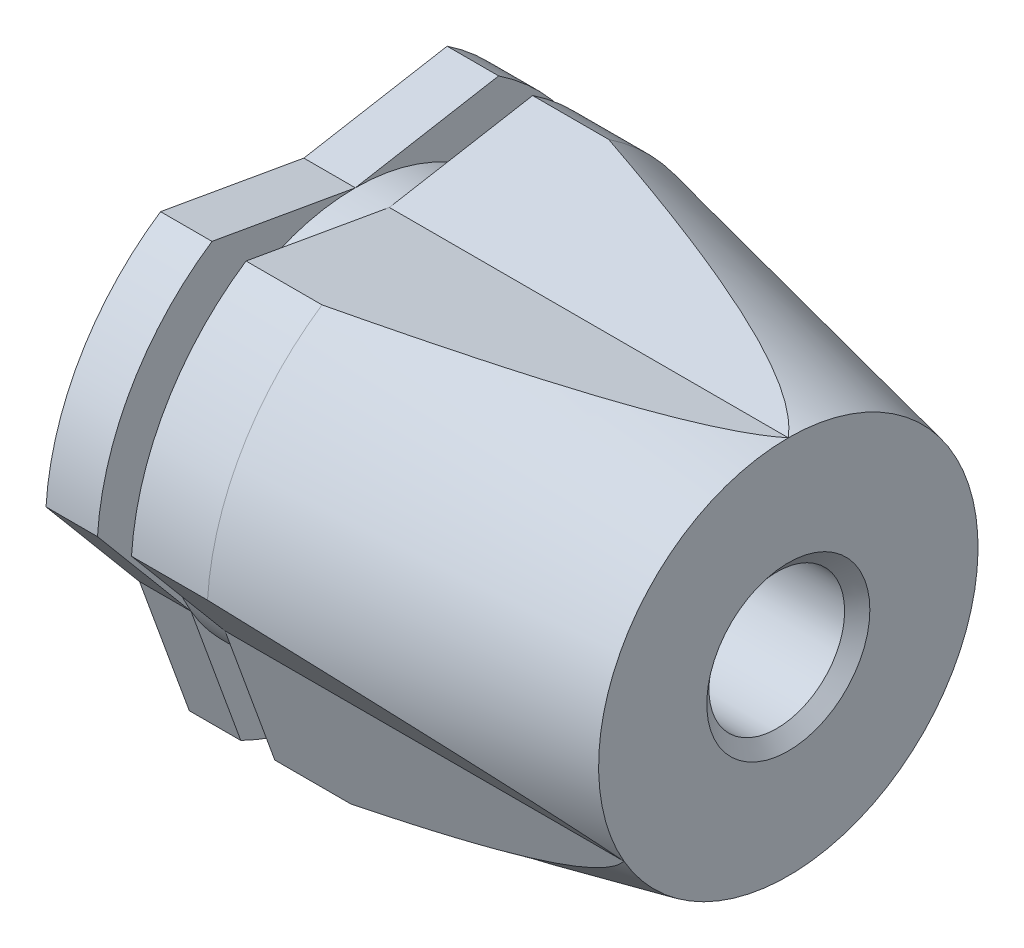
ISO-10303-21;
HEADER;
FILE_DESCRIPTION(('STEP AP214'),'2;1');
FILE_NAME('part.step','',(''),(''),'','','');
FILE_SCHEMA(('AUTOMOTIVE_DESIGN { 1 0 10303 214 1 1 1 1 }'));
ENDSEC;
DATA;
#1=APPLICATION_CONTEXT('core data for automotive mechanical design processes');
#2=APPLICATION_PROTOCOL_DEFINITION('international standard','automotive_design',2000,#1);
#3=PRODUCT_CONTEXT('',#1,'mechanical');
#4=PRODUCT('Part','Part','',(#3));
#5=PRODUCT_RELATED_PRODUCT_CATEGORY('part','',(#4));
#6=PRODUCT_DEFINITION_FORMATION('','',#4);
#7=PRODUCT_DEFINITION_CONTEXT('part definition',#1,'design');
#8=PRODUCT_DEFINITION('design','',#6,#7);
#9=PRODUCT_DEFINITION_SHAPE('','',#8);
#10=(LENGTH_UNIT() NAMED_UNIT(*) SI_UNIT(.MILLI.,.METRE.));
#11=(NAMED_UNIT(*) PLANE_ANGLE_UNIT() SI_UNIT($,.RADIAN.));
#12=(NAMED_UNIT(*) SI_UNIT($,.STERADIAN.) SOLID_ANGLE_UNIT());
#13=UNCERTAINTY_MEASURE_WITH_UNIT(LENGTH_MEASURE(1.E-05),#10,'distance_accuracy_value','');
#14=(GEOMETRIC_REPRESENTATION_CONTEXT(3) GLOBAL_UNCERTAINTY_ASSIGNED_CONTEXT((#13)) GLOBAL_UNIT_ASSIGNED_CONTEXT((#10,
#11,#12)) REPRESENTATION_CONTEXT('',''));
#15=CARTESIAN_POINT('',(0.,0.,0.));
#16=DIRECTION('',(0.,0.,1.));
#17=DIRECTION('',(1.,0.,0.));
#18=AXIS2_PLACEMENT_3D('',#15,#16,#17);
#19=CARTESIAN_POINT('',(5.,0.,0.));
#20=DIRECTION('',(-1.,0.,0.));
#21=DIRECTION('',(0.,0.,1.));
#22=AXIS2_PLACEMENT_3D('',#19,#20,#21);
#23=CYLINDRICAL_SURFACE('',#22,8.);
#24=CARTESIAN_POINT('',(1.59377475880434,0.,0.));
#25=DIRECTION('',(1.,0.,0.));
#26=DIRECTION('',(0.,0.,-1.));
#27=AXIS2_PLACEMENT_3D('',#24,#25,#26);
#28=CIRCLE('',#27,8.);
#29=CARTESIAN_POINT('',(1.59377475880434,-7.17096029452038,3.54645293982764));
#30=VERTEX_POINT('',#29);
#31=CARTESIAN_POINT('',(1.59377475880434,-7.17096029452012,-3.54645293982817));
#32=VERTEX_POINT('',#31);
#33=EDGE_CURVE('E485',#30,#32,#28,.T.);
#34=ORIENTED_EDGE('',*,*,#33,.F.);
#35=DIRECTION('',(-1.,0.,0.));
#36=VECTOR('',#35,1.);
#37=CARTESIAN_POINT('',(5.,-7.17096029452038,3.54645293982764));
#38=LINE('',#37,#36);
#39=CARTESIAN_POINT('',(0.,-7.17096029452039,3.54645293982764));
#40=VERTEX_POINT('',#39);
#41=EDGE_CURVE('E348',#40,#30,#38,.F.);
#42=ORIENTED_EDGE('',*,*,#41,.F.);
#43=CARTESIAN_POINT('',(0.,0.,0.));
#44=DIRECTION('',(1.,0.,0.));
#45=DIRECTION('',(0.,0.,-1.));
#46=AXIS2_PLACEMENT_3D('',#43,#44,#45);
#47=CIRCLE('',#46,8.);
#48=CARTESIAN_POINT('',(0.,-7.17096029452034,-3.54645293982774));
#49=VERTEX_POINT('',#48);
#50=EDGE_CURVE('E266',#40,#49,#47,.T.);
#51=ORIENTED_EDGE('',*,*,#50,.T.);
#52=DIRECTION('',(-1.,0.,0.));
#53=VECTOR('',#52,1.);
#54=CARTESIAN_POINT('',(5.,-7.17096029452034,-3.54645293982774));
#55=LINE('',#54,#53);
#56=EDGE_CURVE('E431',#49,#32,#55,.F.);
#57=ORIENTED_EDGE('',*,*,#56,.T.);
#58=EDGE_LOOP('',(#34,#42,#51,#57));
#59=FACE_BOUND('',#58,.T.);
#60=ADVANCED_FACE('F53',(#59),#23,.T.);
#61=CARTESIAN_POINT('',(2.64728139691783,0.,0.));
#62=DIRECTION('',(-1.,0.,0.));
#63=DIRECTION('',(0.,0.,1.));
#64=AXIS2_PLACEMENT_3D('',#61,#62,#63);
#65=CIRCLE('',#64,8.);
#66=CARTESIAN_POINT('',(2.64728139691783,-7.17096029452012,-3.54645293982817));
#67=VERTEX_POINT('',#66);
#68=CARTESIAN_POINT('',(2.64728139691783,-7.17096029452038,3.54645293982764));
#69=VERTEX_POINT('',#68);
#70=EDGE_CURVE('E76',#67,#69,#65,.T.);
#71=ORIENTED_EDGE('',*,*,#70,.F.);
#72=CARTESIAN_POINT('',(5.0000000000043,-7.17096029451909,-3.54645293982819));
#73=VERTEX_POINT('',#72);
#74=EDGE_CURVE('E430',#67,#73,#55,.F.);
#75=ORIENTED_EDGE('',*,*,#74,.T.);
#76=CARTESIAN_POINT('',(5.,0.,0.));
#77=DIRECTION('',(1.,0.,0.));
#78=DIRECTION('',(0.,0.,-1.));
#79=AXIS2_PLACEMENT_3D('',#76,#77,#78);
#80=CIRCLE('',#79,8.);
#81=CARTESIAN_POINT('',(5.,-7.17096029451996,3.5464529398285));
#82=VERTEX_POINT('',#81);
#83=EDGE_CURVE('E260',#82,#73,#80,.T.);
#84=ORIENTED_EDGE('',*,*,#83,.F.);
#85=EDGE_CURVE('E442',#69,#82,#38,.F.);
#86=ORIENTED_EDGE('',*,*,#85,.F.);
#87=EDGE_LOOP('',(#71,#75,#84,#86));
#88=FACE_BOUND('',#87,.T.);
#89=ADVANCED_FACE('F311',(#88),#23,.T.);
#90=CARTESIAN_POINT('',(1.59377475880434,0.,0.));
#91=DIRECTION('',(1.,0.,0.));
#92=DIRECTION('',(0.,0.,-1.));
#93=AXIS2_PLACEMENT_3D('',#90,#91,#92);
#94=CIRCLE('',#93,8.);
#95=CARTESIAN_POINT('',(1.59377475880434,0.51416180804301,-7.98346025449804));
#96=VERTEX_POINT('',#95);
#97=CARTESIAN_POINT('',(1.59377475880434,6.65679848647695,-4.43700731467034));
#98=VERTEX_POINT('',#97);
#99=EDGE_CURVE('E496',#96,#98,#94,.T.);
#100=ORIENTED_EDGE('',*,*,#99,.F.);
#101=DIRECTION('',(-1.,0.,0.));
#102=VECTOR('',#101,1.);
#103=CARTESIAN_POINT('',(5.,0.514161808043487,-7.98346025449801));
#104=LINE('',#103,#102);
#105=CARTESIAN_POINT('',(0.,0.514161808043488,-7.98346025449801));
#106=VERTEX_POINT('',#105);
#107=EDGE_CURVE('E406',#106,#96,#104,.F.);
#108=ORIENTED_EDGE('',*,*,#107,.F.);
#109=CARTESIAN_POINT('',(0.,6.65679848647695,-4.43700731467034));
#110=VERTEX_POINT('',#109);
#111=EDGE_CURVE('E254',#106,#110,#47,.T.);
#112=ORIENTED_EDGE('',*,*,#111,.T.);
#113=DIRECTION('',(-1.,0.,0.));
#114=VECTOR('',#113,1.);
#115=CARTESIAN_POINT('',(5.,6.65679848647695,-4.43700731467034));
#116=LINE('',#115,#114);
#117=EDGE_CURVE('E245',#110,#98,#116,.F.);
#118=ORIENTED_EDGE('',*,*,#117,.T.);
#119=EDGE_LOOP('',(#100,#108,#112,#118));
#120=FACE_BOUND('',#119,.T.);
#121=ADVANCED_FACE('F318',(#120),#23,.T.);
#122=CARTESIAN_POINT('',(2.64728139691783,0.,0.));
#123=DIRECTION('',(-1.,0.,0.));
#124=DIRECTION('',(0.,0.,1.));
#125=AXIS2_PLACEMENT_3D('',#122,#123,#124);
#126=CIRCLE('',#125,8.);
#127=CARTESIAN_POINT('',(2.64728139691783,6.65679848647695,-4.43700731467034));
#128=VERTEX_POINT('',#127);
#129=CARTESIAN_POINT('',(2.64728139691783,0.51416180804301,-7.98346025449804));
#130=VERTEX_POINT('',#129);
#131=EDGE_CURVE('E221',#128,#130,#126,.T.);
#132=ORIENTED_EDGE('',*,*,#131,.F.);
#133=CARTESIAN_POINT('',(5.0000000000043,6.65679848647673,-4.43700731466904));
#134=VERTEX_POINT('',#133);
#135=EDGE_CURVE('E219',#128,#134,#116,.F.);
#136=ORIENTED_EDGE('',*,*,#135,.T.);
#137=CARTESIAN_POINT('',(5.,0.514161808042532,-7.98346025449807));
#138=VERTEX_POINT('',#137);
#139=EDGE_CURVE('E261',#138,#134,#80,.T.);
#140=ORIENTED_EDGE('',*,*,#139,.F.);
#141=EDGE_CURVE('E405',#130,#138,#104,.F.);
#142=ORIENTED_EDGE('',*,*,#141,.F.);
#143=EDGE_LOOP('',(#132,#136,#140,#142));
#144=FACE_BOUND('',#143,.T.);
#145=ADVANCED_FACE('F329',(#144),#23,.T.);
#146=CARTESIAN_POINT('',(1.59377475880434,0.,0.));
#147=DIRECTION('',(1.,0.,0.));
#148=DIRECTION('',(0.,0.,-1.));
#149=AXIS2_PLACEMENT_3D('',#146,#147,#148);
#150=CIRCLE('',#149,8.);
#151=CARTESIAN_POINT('',(1.59377475880434,6.65679848647722,4.43700731466994));
#152=VERTEX_POINT('',#151);
#153=CARTESIAN_POINT('',(1.59377475880434,0.514161808042869,7.98346025449759));
#154=VERTEX_POINT('',#153);
#155=EDGE_CURVE('E364',#152,#154,#150,.T.);
#156=ORIENTED_EDGE('',*,*,#155,.F.);
#157=DIRECTION('',(-1.,0.,0.));
#158=VECTOR('',#157,1.);
#159=CARTESIAN_POINT('',(5.,6.65679848647695,4.43700731467034));
#160=LINE('',#159,#158);
#161=CARTESIAN_POINT('',(0.,6.65679848647695,4.43700731467035));
#162=VERTEX_POINT('',#161);
#163=EDGE_CURVE('E241',#162,#152,#160,.F.);
#164=ORIENTED_EDGE('',*,*,#163,.F.);
#165=CARTESIAN_POINT('',(0.,0.514161808043377,7.98346025449802));
#166=VERTEX_POINT('',#165);
#167=EDGE_CURVE('E262',#162,#166,#47,.T.);
#168=ORIENTED_EDGE('',*,*,#167,.T.);
#169=DIRECTION('',(-1.,0.,0.));
#170=VECTOR('',#169,1.);
#171=CARTESIAN_POINT('',(5.,0.514161808043374,7.98346025449802));
#172=LINE('',#171,#170);
#173=EDGE_CURVE('E343',#166,#154,#172,.F.);
#174=ORIENTED_EDGE('',*,*,#173,.T.);
#175=EDGE_LOOP('',(#156,#164,#168,#174));
#176=FACE_BOUND('',#175,.T.);
#177=ADVANCED_FACE('F322',(#176),#23,.T.);
#178=CARTESIAN_POINT('',(2.64728139691783,0.,0.));
#179=DIRECTION('',(-1.,0.,0.));
#180=DIRECTION('',(0.,0.,1.));
#181=AXIS2_PLACEMENT_3D('',#178,#179,#180);
#182=CIRCLE('',#181,8.);
#183=CARTESIAN_POINT('',(2.64728139691783,0.514161808042869,7.98346025449759));
#184=VERTEX_POINT('',#183);
#185=CARTESIAN_POINT('',(2.64728139691783,6.65679848647722,4.43700731466994));
#186=VERTEX_POINT('',#185);
#187=EDGE_CURVE('E184',#184,#186,#182,.T.);
#188=ORIENTED_EDGE('',*,*,#187,.F.);
#189=CARTESIAN_POINT('',(5.0000000000043,0.51416180804236,7.98346025449717));
#190=VERTEX_POINT('',#189);
#191=EDGE_CURVE('E333',#184,#190,#172,.F.);
#192=ORIENTED_EDGE('',*,*,#191,.T.);
#193=CARTESIAN_POINT('',(5.,6.65679848647749,4.43700731466955));
#194=VERTEX_POINT('',#193);
#195=EDGE_CURVE('E256',#194,#190,#80,.T.);
#196=ORIENTED_EDGE('',*,*,#195,.F.);
#197=EDGE_CURVE('E235',#186,#194,#160,.F.);
#198=ORIENTED_EDGE('',*,*,#197,.F.);
#199=EDGE_LOOP('',(#188,#192,#196,#198));
#200=FACE_BOUND('',#199,.T.);
#201=ADVANCED_FACE('F313',(#200),#23,.T.);
#202=CARTESIAN_POINT('',(0.,5.6972985122888,1.0045874448667));
#203=DIRECTION('',(0.,-0.984807753012208,-0.173648177666927));
#204=DIRECTION('',(0.,0.173648177666927,-0.984807753012209));
#205=AXIS2_PLACEMENT_3D('',#202,#203,#204);
#206=PLANE('',#205);
#207=DIRECTION('',(0.,-0.173648177666927,0.984807753012209));
#208=VECTOR('',#207,1.);
#209=CARTESIAN_POINT('',(1.59377475880434,5.6972985122888,1.0045874448667));
#210=LINE('',#209,#208);
#211=CARTESIAN_POINT('',(1.59377475880434,5.87443438329977,0.));
#212=VERTEX_POINT('',#211);
#213=EDGE_CURVE('E489',#98,#212,#210,.T.);
#214=ORIENTED_EDGE('',*,*,#213,.F.);
#215=ORIENTED_EDGE('',*,*,#117,.F.);
#216=DIRECTION('',(0.,0.173648177666927,-0.984807753012209));
#217=VECTOR('',#216,1.);
#218=CARTESIAN_POINT('',(0.,5.6972985122888,1.0045874448667));
#219=LINE('',#218,#217);
#220=CARTESIAN_POINT('',(0.,5.87443438329977,0.));
#221=VERTEX_POINT('',#220);
#222=EDGE_CURVE('E230',#221,#110,#219,.T.);
#223=ORIENTED_EDGE('',*,*,#222,.F.);
#224=DIRECTION('',(1.,0.,0.));
#225=VECTOR('',#224,1.);
#226=CARTESIAN_POINT('',(0.,5.87443438329977,0.));
#227=LINE('',#226,#225);
#228=EDGE_CURVE('E229',#221,#212,#227,.T.);
#229=ORIENTED_EDGE('',*,*,#228,.T.);
#230=EDGE_LOOP('',(#214,#215,#223,#229));
#231=FACE_BOUND('',#230,.T.);
#232=ADVANCED_FACE('F288',(#231),#206,.F.);
#233=DIRECTION('',(0.,0.173648177666927,-0.984807753012209));
#234=VECTOR('',#233,1.);
#235=CARTESIAN_POINT('',(2.64728139691783,5.6972985122888,1.0045874448667));
#236=LINE('',#235,#234);
#237=CARTESIAN_POINT('',(2.64728139691783,5.87443438329977,0.));
#238=VERTEX_POINT('',#237);
#239=EDGE_CURVE('E189',#238,#128,#236,.T.);
#240=ORIENTED_EDGE('',*,*,#239,.F.);
#241=CARTESIAN_POINT('',(15.,5.87443438329977,0.));
#242=VERTEX_POINT('',#241);
#243=EDGE_CURVE('E217',#238,#242,#227,.T.);
#244=ORIENTED_EDGE('',*,*,#243,.T.);
#245=CARTESIAN_POINT('',(4.9993,6.65683589353977,-4.43721946066561));
#246=CARTESIAN_POINT('',(5.31861236245896,6.63976852290642,-4.34042559188401));
#247=CARTESIAN_POINT('',(5.63755600687272,6.62249037544687,-4.24243634831996));
#248=CARTESIAN_POINT('',(6.27453945604708,6.58742248098328,-4.04355643599634));
#249=CARTESIAN_POINT('',(6.59257917812117,6.56963268873282,-3.94266551063157));
#250=CARTESIAN_POINT('',(7.22803683039662,6.53342567182418,-3.73732531389498));
#251=CARTESIAN_POINT('',(7.54545296593898,6.51500749383312,-3.63287063590381));
#252=CARTESIAN_POINT('',(8.17884855781919,6.47744732414788,-3.41985632842616));
#253=CARTESIAN_POINT('',(8.49482806500824,6.45830535830003,-3.3112968455215));
#254=CARTESIAN_POINT('',(9.2329154230582,6.41243225101641,-3.05113752617448));
#255=CARTESIAN_POINT('',(9.6543035197892,6.38534740636568,-2.89753173911964));
#256=CARTESIAN_POINT('',(10.2826210350122,6.34310285732095,-2.65795099614432));
#257=CARTESIAN_POINT('',(10.4913650257737,6.3287567564019,-2.57659021481973));
#258=CARTESIAN_POINT('',(10.9073278352411,6.29941370600297,-2.4101775065601));
#259=CARTESIAN_POINT('',(11.1145467017268,6.28441677701495,-2.3251256958403));
#260=CARTESIAN_POINT('',(11.6003234068065,6.24816836804422,-2.11955075305449));
#261=CARTESIAN_POINT('',(11.8780714236627,6.22658769317196,-1.99716066399637));
#262=CARTESIAN_POINT('',(12.4287357152088,6.18146489952355,-1.74125658472776));
#263=CARTESIAN_POINT('',(12.7016458927185,6.15792049316337,-1.60772962098359));
#264=CARTESIAN_POINT('',(13.0933911821179,6.12157505269203,-1.40160438521246));
#265=CARTESIAN_POINT('',(13.2155819018149,6.10986572196956,-1.33519747076625));
#266=CARTESIAN_POINT('',(13.4576270565982,6.08574291710586,-1.19839024610457));
#267=CARTESIAN_POINT('',(13.5774818359836,6.07332954780519,-1.12799053046944));
#268=CARTESIAN_POINT('',(13.8138353249092,6.0476707683746,-0.982472361171154));
#269=CARTESIAN_POINT('',(13.9303411609516,6.03442735079571,-0.9073652078264));
#270=CARTESIAN_POINT('',(14.1590656274899,6.00687480456898,-0.751106953326557));
#271=CARTESIAN_POINT('',(14.2712862343952,5.99256617641724,-0.669958690625931));
#272=CARTESIAN_POINT('',(14.4809018399964,5.96377669885971,-0.506685449957631));
#273=CARTESIAN_POINT('',(14.5787661196691,5.94940005016894,-0.425151423610638));
#274=CARTESIAN_POINT('',(14.7671677698552,5.91911393603385,-0.253390335129436));
#275=CARTESIAN_POINT('',(14.8576749882363,5.90319869570585,-0.163130522002412));
#276=CARTESIAN_POINT('',(15.0281237282215,5.86918892027109,0.0297484991100684));
#277=CARTESIAN_POINT('',(15.1078447571875,5.85106019998525,0.132561580880077));
#278=CARTESIAN_POINT('',(15.2459028909824,5.81261433627432,0.350598908783369));
#279=CARTESIAN_POINT('',(15.3044634147981,5.79232317500752,0.46567580277472));
#280=CARTESIAN_POINT('',(15.369982943394,5.75926122151717,0.65317945852561));
#281=CARTESIAN_POINT('',(15.3883071687971,5.74717938532225,0.721698956485443));
#282=CARTESIAN_POINT('',(15.4134599558605,5.72247621666328,0.861797587788001));
#283=CARTESIAN_POINT('',(15.4201086152957,5.70984946196539,0.933407472146943));
#284=CARTESIAN_POINT('',(15.4198685455638,5.6971750834023,1.00528744486669));
#285=B_SPLINE_CURVE_WITH_KNOTS('',3,(#245,#246,#247,#248,#249,#250,#251,#252,#253,#254,#255,
#256,#257,#258,#259,#260,#261,#262,#263,#264,#265,#266,#267,#268,#269,#270,#271,#272,#273,#274,
#275,#276,#277,#278,#279,#280,#281,#282,#283,#284),.UNSPECIFIED.,.F.,.F.,(4,2,2,2,2,2,2,2,2,2,2,
2,2,2,2,2,2,2,2,4),(0.,1.00229497140458,2.00467885323664,3.00865773656117,4.01260080178053,
5.36041566769028,6.03388215905735,6.70732746111592,7.62002698129565,8.53380498180935,
8.952432055995,9.37099695397846,9.78859294458712,10.2059939485494,10.5901987801624,
10.9759062210309,11.3685838870002,11.7569852464762,11.9719101110546,12.1901184958015),.UNSPECIFIED.);
#286=EDGE_CURVE('E275',#134,#242,#285,.T.);
#287=ORIENTED_EDGE('',*,*,#286,.F.);
#288=ORIENTED_EDGE('',*,*,#135,.F.);
#289=EDGE_LOOP('',(#240,#244,#287,#288));
#290=FACE_BOUND('',#289,.T.);
#291=ADVANCED_FACE('F215',(#290),#206,.F.);
#292=CARTESIAN_POINT('',(0.,5.6972985122888,-1.0045874448667));
#293=DIRECTION('',(0.,0.984807753012208,-0.173648177666927));
#294=DIRECTION('',(0.,0.173648177666927,0.984807753012209));
#295=AXIS2_PLACEMENT_3D('',#292,#293,#294);
#296=PLANE('',#295);
#297=ORIENTED_EDGE('',*,*,#163,.T.);
#298=DIRECTION('',(0.,-0.173648177666927,-0.984807753012209));
#299=VECTOR('',#298,1.);
#300=CARTESIAN_POINT('',(1.59377475880434,5.6972985122888,-1.0045874448667));
#301=LINE('',#300,#299);
#302=EDGE_CURVE('E484',#152,#212,#301,.T.);
#303=ORIENTED_EDGE('',*,*,#302,.T.);
#304=ORIENTED_EDGE('',*,*,#228,.F.);
#305=DIRECTION('',(0.,0.173648177666927,0.984807753012209));
#306=VECTOR('',#305,1.);
#307=CARTESIAN_POINT('',(0.,5.6972985122888,-1.0045874448667));
#308=LINE('',#307,#306);
#309=EDGE_CURVE('E237',#221,#162,#308,.T.);
#310=ORIENTED_EDGE('',*,*,#309,.T.);
#311=EDGE_LOOP('',(#297,#303,#304,#310));
#312=FACE_BOUND('',#311,.T.);
#313=ADVANCED_FACE('F284',(#312),#296,.T.);
#314=ORIENTED_EDGE('',*,*,#243,.F.);
#315=DIRECTION('',(0.,0.173648177666927,0.984807753012209));
#316=VECTOR('',#315,1.);
#317=CARTESIAN_POINT('',(2.64728139691783,5.6972985122888,-1.0045874448667));
#318=LINE('',#317,#316);
#319=EDGE_CURVE('E178',#238,#186,#318,.T.);
#320=ORIENTED_EDGE('',*,*,#319,.T.);
#321=ORIENTED_EDGE('',*,*,#197,.T.);
#322=CARTESIAN_POINT('',(4.9992999999997,6.65683589353979,4.4372194606657));
#323=CARTESIAN_POINT('',(5.31861236245867,6.63976852290643,4.3404255918841));
#324=CARTESIAN_POINT('',(5.63755600687244,6.62249037544688,4.24243634832005));
#325=CARTESIAN_POINT('',(6.27453945604681,6.58742248098329,4.04355643599643));
#326=CARTESIAN_POINT('',(6.5925791781209,6.56963268873284,3.94266551063165));
#327=CARTESIAN_POINT('',(7.22803683039637,6.53342567182419,3.73732531389506));
#328=CARTESIAN_POINT('',(7.54545296593873,6.51500749383314,3.6328706359039));
#329=CARTESIAN_POINT('',(8.17884855781896,6.4774473241479,3.41985632842624));
#330=CARTESIAN_POINT('',(8.49482806500802,6.45830535830005,3.31129684552158));
#331=CARTESIAN_POINT('',(9.232915423058,6.41243225101642,3.05113752617456));
#332=CARTESIAN_POINT('',(9.65430351978901,6.38534740636569,2.89753173911971));
#333=CARTESIAN_POINT('',(10.282621035012,6.34310285732096,2.65795099614439));
#334=CARTESIAN_POINT('',(10.4913650257736,6.32875675640192,2.5765902148198));
#335=CARTESIAN_POINT('',(10.907327835241,6.29941370600298,2.41017750656017));
#336=CARTESIAN_POINT('',(11.1145467017267,6.28441677701496,2.32512569584036));
#337=CARTESIAN_POINT('',(11.6003234068064,6.24816836804423,2.11955075305455));
#338=CARTESIAN_POINT('',(11.8780714236625,6.22658769317197,1.99716066399642));
#339=CARTESIAN_POINT('',(12.4287357152087,6.18146489952356,1.74125658472781));
#340=CARTESIAN_POINT('',(12.7016458927184,6.15792049316338,1.60772962098363));
#341=CARTESIAN_POINT('',(13.0933911821178,6.12157505269204,1.40160438521251));
#342=CARTESIAN_POINT('',(13.2155819018148,6.10986572196957,1.3351974707663));
#343=CARTESIAN_POINT('',(13.4576270565981,6.08574291710587,1.19839024610462));
#344=CARTESIAN_POINT('',(13.5774818359835,6.0733295478052,1.12799053046949));
#345=CARTESIAN_POINT('',(13.8138353249091,6.04767076837461,0.982472361171211));
#346=CARTESIAN_POINT('',(13.9303411609515,6.03442735079572,0.907365207826461));
#347=CARTESIAN_POINT('',(14.1590656274898,6.00687480456899,0.751106953326624));
#348=CARTESIAN_POINT('',(14.2712862343951,5.99256617641725,0.669958690625999));
#349=CARTESIAN_POINT('',(14.4809018399963,5.96377669885972,0.506685449957701));
#350=CARTESIAN_POINT('',(14.578766119669,5.94940005016895,0.425151423610708));
#351=CARTESIAN_POINT('',(14.7671677698551,5.91911393603386,0.253390335129505));
#352=CARTESIAN_POINT('',(14.8576749882362,5.90319869570587,0.163130522002479));
#353=CARTESIAN_POINT('',(15.0281237282215,5.8691889202711,-0.0297484991100054));
#354=CARTESIAN_POINT('',(15.1078447571874,5.85106019998526,-0.132561580880016));
#355=CARTESIAN_POINT('',(15.2459028909824,5.81261433627433,-0.35059890878331));
#356=CARTESIAN_POINT('',(15.3044634147981,5.79232317500753,-0.465675802774662));
#357=CARTESIAN_POINT('',(15.369982943394,5.75926122151717,-0.653179458525563));
#358=CARTESIAN_POINT('',(15.3883071687971,5.74717938532226,-0.721698956485404));
#359=CARTESIAN_POINT('',(15.4134599558605,5.72247621666328,-0.861797587787982));
#360=CARTESIAN_POINT('',(15.4201086152957,5.70984946196539,-0.933407472146934));
#361=CARTESIAN_POINT('',(15.4198685455638,5.6971750834023,-1.0052874448667));
#362=B_SPLINE_CURVE_WITH_KNOTS('',3,(#322,#323,#324,#325,#326,#327,#328,#329,#330,#331,#332,
#333,#334,#335,#336,#337,#338,#339,#340,#341,#342,#343,#344,#345,#346,#347,#348,#349,#350,#351,
#352,#353,#354,#355,#356,#357,#358,#359,#360,#361),.UNSPECIFIED.,.F.,.F.,(4,2,2,2,2,2,2,2,2,2,2,
2,2,2,2,2,2,2,2,4),(0.,1.0022949714046,2.00467885323668,3.00865773656124,4.01260080178062,
5.3604156676904,6.03388215905749,6.70732746111607,7.62002698129583,8.53380498180955,
8.9524320559952,9.37099695397867,9.78859294458733,10.2059939485496,10.5901987801626,
10.9759062210311,11.3685838870004,11.7569852464765,11.9719101110549,12.1901184958019),.UNSPECIFIED.);
#363=EDGE_CURVE('E226',#194,#242,#362,.T.);
#364=ORIENTED_EDGE('',*,*,#363,.T.);
#365=EDGE_LOOP('',(#314,#320,#321,#364));
#366=FACE_BOUND('',#365,.T.);
#367=ADVANCED_FACE('F224',(#366),#296,.T.);
#368=CARTESIAN_POINT('',(0.,-1.97865100856689,-5.43629896701876));
#369=DIRECTION('',(0.,0.342020143325663,0.939692620785911));
#370=DIRECTION('',(0.,-0.939692620785911,0.342020143325663));
#371=AXIS2_PLACEMENT_3D('',#368,#369,#370);
#372=PLANE('',#371);
#373=DIRECTION('',(0.,0.939692620785911,-0.342020143325663));
#374=VECTOR('',#373,1.);
#375=CARTESIAN_POINT('',(1.59377475880434,-1.97865100856689,-5.43629896701876));
#376=LINE('',#375,#374);
#377=CARTESIAN_POINT('',(1.59377475880434,-2.93721719164984,-5.0874094088024));
#378=VERTEX_POINT('',#377);
#379=EDGE_CURVE('E482',#32,#378,#376,.T.);
#380=ORIENTED_EDGE('',*,*,#379,.F.);
#381=ORIENTED_EDGE('',*,*,#56,.F.);
#382=DIRECTION('',(0.,-0.939692620785911,0.342020143325663));
#383=VECTOR('',#382,1.);
#384=CARTESIAN_POINT('',(0.,-1.97865100856689,-5.43629896701876));
#385=LINE('',#384,#383);
#386=CARTESIAN_POINT('',(0.,-2.93721719164984,-5.0874094088024));
#387=VERTEX_POINT('',#386);
#388=EDGE_CURVE('E389',#387,#49,#385,.T.);
#389=ORIENTED_EDGE('',*,*,#388,.F.);
#390=DIRECTION('',(1.,0.,0.));
#391=VECTOR('',#390,1.);
#392=CARTESIAN_POINT('',(0.,-2.93721719164984,-5.0874094088024));
#393=LINE('',#392,#391);
#394=EDGE_CURVE('E380',#387,#378,#393,.T.);
#395=ORIENTED_EDGE('',*,*,#394,.T.);
#396=EDGE_LOOP('',(#380,#381,#389,#395));
#397=FACE_BOUND('',#396,.T.);
#398=ADVANCED_FACE('F415',(#397),#372,.F.);
#399=DIRECTION('',(0.,-0.939692620785911,0.342020143325663));
#400=VECTOR('',#399,1.);
#401=CARTESIAN_POINT('',(2.64728139691783,-1.97865100856689,-5.43629896701876));
#402=LINE('',#401,#400);
#403=CARTESIAN_POINT('',(2.64728139691783,-2.93721719164984,-5.0874094088024));
#404=VERTEX_POINT('',#403);
#405=EDGE_CURVE('E190',#404,#67,#402,.T.);
#406=ORIENTED_EDGE('',*,*,#405,.F.);
#407=CARTESIAN_POINT('',(15.,-2.93721719164984,-5.0874094088024));
#408=VERTEX_POINT('',#407);
#409=EDGE_CURVE('E394',#404,#408,#393,.T.);
#410=ORIENTED_EDGE('',*,*,#409,.T.);
#411=CARTESIAN_POINT('',(4.9993,-7.17116272187296,-3.54637926229678));
#412=CARTESIAN_POINT('',(5.31860993420716,-7.07880379015554,-3.57999516431055));
#413=CARTESIAN_POINT('',(5.63755115568578,-6.98530426181964,-3.61402620954274));
#414=CARTESIAN_POINT('',(6.27452977344227,-6.79553674333685,-3.68309593770104));
#415=CARTESIAN_POINT('',(6.59256708703781,-6.6992685083524,-3.71813470974072));
#416=CARTESIAN_POINT('',(7.22801990363696,-6.50333677401969,-3.78944802898598));
#417=CARTESIAN_POINT('',(7.54543361214067,-6.40366811619012,-3.82572445372521));
#418=CARTESIAN_POINT('',(8.17882438006745,-6.20041397890775,-3.89970290968744));
#419=CARTESIAN_POINT('',(8.49480149033882,-6.09682863931391,-3.93740489000596));
#420=CARTESIAN_POINT('',(9.23288454096423,-5.8485893442022,-4.02775660440184));
#421=CARTESIAN_POINT('',(9.65427073425303,-5.70202134905906,-4.08110299193002));
#422=CARTESIAN_POINT('',(10.2825854837101,-5.47341763521124,-4.16430793921333));
#423=CARTESIAN_POINT('',(10.4913285739186,-5.39578462853378,-4.19256404284052));
#424=CARTESIAN_POINT('',(10.9072896181436,-5.23699663662856,-4.25035814545292));
#425=CARTESIAN_POINT('',(11.1145076199362,-5.15584176228381,-4.27989610408002));
#426=CARTESIAN_POINT('',(11.6002831946898,-4.95968566324644,-4.35129108539939));
#427=CARTESIAN_POINT('',(11.8780309564381,-4.84290302518825,-4.39379648953166));
#428=CARTESIAN_POINT('',(12.4286948252496,-4.59872366060599,-4.48267051006163));
#429=CARTESIAN_POINT('',(12.7016048359246,-4.47131455642933,-4.52904363155646));
#430=CARTESIAN_POINT('',(13.0933480655212,-4.27463462945446,-4.60062927065296));
#431=CARTESIAN_POINT('',(13.2155368202723,-4.21127144640753,-4.6236915832304));
#432=CARTESIAN_POINT('',(13.4575782110812,-4.08073485792162,-4.67120301592193));
#433=CARTESIAN_POINT('',(13.5774311913752,-4.01356201972613,-4.69565192957627));
#434=CARTESIAN_POINT('',(13.8137813481116,-3.87471407648586,-4.74618844800481));
#435=CARTESIAN_POINT('',(13.9302856501249,-3.80304975281533,-4.7722721286797));
#436=CARTESIAN_POINT('',(14.159007448037,-3.65395446144194,-4.82653837680886));
#437=CARTESIAN_POINT('',(14.271226919815,-3.57652620148228,-4.8547199587252));
#438=CARTESIAN_POINT('',(14.4808444255103,-3.42073553515058,-4.91142312404644));
#439=CARTESIAN_POINT('',(14.5787115111909,-3.34293674811275,-4.93973956679022));
#440=CARTESIAN_POINT('',(14.7671191439494,-3.17904446091557,-4.9993914809558));
#441=CARTESIAN_POINT('',(14.8576295389223,-3.09291970914448,-5.03073832703404));
#442=CARTESIAN_POINT('',(15.0280851475265,-2.90887714210987,-5.09772434327258));
#443=CARTESIAN_POINT('',(15.1078098915393,-2.81077434624946,-5.13343084086406));
#444=CARTESIAN_POINT('',(15.2458763493224,-2.60272606240453,-5.20915422347378));
#445=CARTESIAN_POINT('',(15.304441479741,-2.49292118279288,-5.24911993122961));
#446=CARTESIAN_POINT('',(15.3699729410345,-2.31399517622982,-5.31424367175468));
#447=CARTESIAN_POINT('',(15.3883024299719,-2.24860213293117,-5.33804479304347));
#448=CARTESIAN_POINT('',(15.4134613716515,-2.11489521934158,-5.38671012970568));
#449=CARTESIAN_POINT('',(15.4201107899759,-2.04655198405252,-5.41158503306435));
#450=CARTESIAN_POINT('',(15.4198685253644,-1.97795100856689,-5.43655374618274));
#451=B_SPLINE_CURVE_WITH_KNOTS('',3,(#411,#412,#413,#414,#415,#416,#417,#418,#419,#420,#421,
#422,#423,#424,#425,#426,#427,#428,#429,#430,#431,#432,#433,#434,#435,#436,#437,#438,#439,#440,
#441,#442,#443,#444,#445,#446,#447,#448,#449,#450),.UNSPECIFIED.,.F.,.F.,(4,2,2,2,2,2,2,2,2,2,2,
2,2,2,2,2,2,2,2,4),(0.,1.00228734868397,2.00466360412365,3.00863473677676,4.01257005288459,
5.36037852599279,6.03384186329574,6.70728401253986,7.61998202323397,8.53375839800679,
8.95237791512787,9.37093526417063,9.78852377189802,10.2059173308447,10.5901284568661,
10.9758422822302,11.3685260370919,11.7569332625174,11.9719002029034,12.1901524499655),.UNSPECIFIED.);
#452=EDGE_CURVE('E422',#73,#408,#451,.T.);
#453=ORIENTED_EDGE('',*,*,#452,.F.);
#454=ORIENTED_EDGE('',*,*,#74,.F.);
#455=EDGE_LOOP('',(#406,#410,#453,#454));
#456=FACE_BOUND('',#455,.T.);
#457=ADVANCED_FACE('F413',(#456),#372,.F.);
#458=CARTESIAN_POINT('',(0.,-3.71864750372182,-4.43171152215208));
#459=DIRECTION('',(0.,-0.64278760968653,-0.766044443118986));
#460=DIRECTION('',(0.,0.766044443118986,-0.64278760968653));
#461=AXIS2_PLACEMENT_3D('',#458,#459,#460);
#462=PLANE('',#461);
#463=ORIENTED_EDGE('',*,*,#107,.T.);
#464=DIRECTION('',(0.,-0.766044443118986,0.64278760968653));
#465=VECTOR('',#464,1.);
#466=CARTESIAN_POINT('',(1.59377475880434,-3.71864750372182,-4.43171152215208));
#467=LINE('',#466,#465);
#468=EDGE_CURVE('E499',#96,#378,#467,.T.);
#469=ORIENTED_EDGE('',*,*,#468,.T.);
#470=ORIENTED_EDGE('',*,*,#394,.F.);
#471=DIRECTION('',(0.,0.766044443118986,-0.64278760968653));
#472=VECTOR('',#471,1.);
#473=CARTESIAN_POINT('',(0.,-3.71864750372182,-4.43171152215208));
#474=LINE('',#473,#472);
#475=EDGE_CURVE('E386',#387,#106,#474,.T.);
#476=ORIENTED_EDGE('',*,*,#475,.T.);
#477=EDGE_LOOP('',(#463,#469,#470,#476));
#478=FACE_BOUND('',#477,.T.);
#479=ADVANCED_FACE('F408',(#478),#462,.T.);
#480=ORIENTED_EDGE('',*,*,#409,.F.);
#481=DIRECTION('',(0.,0.766044443118986,-0.64278760968653));
#482=VECTOR('',#481,1.);
#483=CARTESIAN_POINT('',(2.64728139691783,-3.71864750372182,-4.43171152215208));
#484=LINE('',#483,#482);
#485=EDGE_CURVE('E210',#404,#130,#484,.T.);
#486=ORIENTED_EDGE('',*,*,#485,.T.);
#487=ORIENTED_EDGE('',*,*,#141,.T.);
#488=CARTESIAN_POINT('',(4.9993,0.514326828333294,-7.98359872296232));
#489=CARTESIAN_POINT('',(5.31859792259165,0.43903797179181,-7.92042387120661));
#490=CARTESIAN_POINT('',(5.63752715875371,0.362819359803315,-7.85646886199822));
#491=CARTESIAN_POINT('',(6.274481877366,0.208125450117578,-7.72666525943555));
#492=CARTESIAN_POINT('',(6.59250727715454,0.129649952876481,-7.66081649864409));
#493=CARTESIAN_POINT('',(7.2279361735967,-0.0300686047147068,-7.52679671587716));
#494=CARTESIAN_POINT('',(7.54533787653722,-0.111315868463747,-7.45862216683118));
#495=CARTESIAN_POINT('',(8.17870478234083,-0.27700310568038,-7.31959406719193));
#496=CARTESIAN_POINT('',(8.49467003603798,-0.361442965165271,-7.24874061224149));
#497=CARTESIAN_POINT('',(9.23273177876877,-0.563802080323395,-7.07894115334696));
#498=CARTESIAN_POINT('',(9.6541085556887,-0.683281610171797,-6.97868592391793));
#499=CARTESIAN_POINT('',(10.282409622775,-0.869634732457303,-6.82231708773943));
#500=CARTESIAN_POINT('',(10.4911482578811,-0.932919532343134,-6.7692148354961));
#501=CARTESIAN_POINT('',(10.9071005692986,-1.0623599866203,-6.66060139805272));
#502=CARTESIAN_POINT('',(11.1143142933678,-1.12851555065234,-6.6050902886731));
#503=CARTESIAN_POINT('',(11.6000842754623,-1.28841851429413,-6.47091577085713));
#504=CARTESIAN_POINT('',(11.8778307743446,-1.38361806979399,-6.39103385894896));
#505=CARTESIAN_POINT('',(12.4284925502139,-1.58266900012859,-6.2240102967197));
#506=CARTESIAN_POINT('',(12.701401734729,-1.68653045907356,-6.13686018482545));
#507=CARTESIAN_POINT('',(13.0931347712281,-1.84685538729573,-6.00233159668571));
#508=CARTESIAN_POINT('',(13.2153138030207,-1.89850324683216,-5.9589938967976));
#509=CARTESIAN_POINT('',(13.4573365686185,-2.00490415409933,-5.86971293475279));
#510=CARTESIAN_POINT('',(13.577180646348,-2.05965673980583,-5.82377006028046));
#511=CARTESIAN_POINT('',(13.8135143136063,-2.17283098070103,-5.72880559648653));
#512=CARTESIAN_POINT('',(13.9300110241014,-2.23124385192832,-5.67979137778371));
#513=CARTESIAN_POINT('',(14.1587196145818,-2.35276889653568,-5.57781975767487));
#514=CARTESIAN_POINT('',(14.270933467826,-2.41587886527788,-5.52486420617969));
#515=CARTESIAN_POINT('',(14.4805603697452,-2.54286910006368,-5.4183067470078));
#516=CARTESIAN_POINT('',(14.5784413366072,-2.60629094835668,-5.36508949749657));
#517=CARTESIAN_POINT('',(14.7668785646431,-2.73989621380545,-5.25298136853516));
#518=CARTESIAN_POINT('',(14.8574046738491,-2.81010511145192,-5.19406910841465));
#519=CARTESIAN_POINT('',(15.0278942604265,-2.96013616035043,-5.06817811061877));
#520=CARTESIAN_POINT('',(15.1076373820254,-3.04010906232844,-5.00107287806485));
#521=CARTESIAN_POINT('',(15.2457450169904,-3.20970950718327,-4.85876120733966));
#522=CARTESIAN_POINT('',(15.3043329354346,-3.29922239847055,-4.7836509732749));
#523=CARTESIAN_POINT('',(15.3699234432312,-3.4451330148871,-4.66121742885492));
#524=CARTESIAN_POINT('',(15.3882789825695,-3.49849232389686,-4.61644365234496));
#525=CARTESIAN_POINT('',(15.4134683806847,-3.60759749902704,-4.52489354013369));
#526=CARTESIAN_POINT('',(15.420121549978,-3.66336739550541,-4.4780970405679));
#527=CARTESIAN_POINT('',(15.4198684114767,-3.71934750372182,-4.43112415241025));
#528=B_SPLINE_CURVE_WITH_KNOTS('',3,(#488,#489,#490,#491,#492,#493,#494,#495,#496,#497,#498,
#499,#500,#501,#502,#503,#504,#505,#506,#507,#508,#509,#510,#511,#512,#513,#514,#515,#516,#517,
#518,#519,#520,#521,#522,#523,#524,#525,#526,#527),.UNSPECIFIED.,.F.,.F.,(4,2,2,2,2,2,2,2,2,2,2,
2,2,2,2,2,2,2,2,4),(0.,1.00224964205553,2.00458817270611,3.00852096599125,4.01241795044621,
5.3601947984322,6.03364253252546,6.70706908474015,7.61975962561206,8.53352795569483,
8.95211008077271,9.37063007794851,9.78818156045831,10.2055382814226,10.5897805469339,
10.9755259574577,11.368239835268,11.7566760804675,11.9718511928206,12.1903204596282),.UNSPECIFIED.);
#529=EDGE_CURVE('E385',#138,#408,#528,.T.);
#530=ORIENTED_EDGE('',*,*,#529,.T.);
#531=EDGE_LOOP('',(#480,#486,#487,#530));
#532=FACE_BOUND('',#531,.T.);
#533=ADVANCED_FACE('F412',(#532),#462,.T.);
#534=CARTESIAN_POINT('',(0.,-3.71864750372188,4.43171152215203));
#535=DIRECTION('',(0.,0.642787609686541,-0.766044443118977));
#536=DIRECTION('',(0.,0.766044443118977,0.642787609686541));
#537=AXIS2_PLACEMENT_3D('',#534,#535,#536);
#538=PLANE('',#537);
#539=DIRECTION('',(0.,-0.766044443118977,-0.642787609686541));
#540=VECTOR('',#539,1.);
#541=CARTESIAN_POINT('',(1.59377475880434,-3.71864750372188,4.43171152215203));
#542=LINE('',#541,#540);
#543=CARTESIAN_POINT('',(1.59377475880434,-2.93721719164991,5.08740940880236));
#544=VERTEX_POINT('',#543);
#545=EDGE_CURVE('E539',#154,#544,#542,.T.);
#546=ORIENTED_EDGE('',*,*,#545,.F.);
#547=ORIENTED_EDGE('',*,*,#173,.F.);
#548=DIRECTION('',(0.,0.766044443118977,0.642787609686541));
#549=VECTOR('',#548,1.);
#550=CARTESIAN_POINT('',(0.,-3.71864750372188,4.43171152215203));
#551=LINE('',#550,#549);
#552=CARTESIAN_POINT('',(0.,-2.93721719164991,5.08740940880236));
#553=VERTEX_POINT('',#552);
#554=EDGE_CURVE('E368',#553,#166,#551,.T.);
#555=ORIENTED_EDGE('',*,*,#554,.F.);
#556=DIRECTION('',(1.,0.,0.));
#557=VECTOR('',#556,1.);
#558=CARTESIAN_POINT('',(0.,-2.93721719164991,5.08740940880236));
#559=LINE('',#558,#557);
#560=EDGE_CURVE('E378',#553,#544,#559,.T.);
#561=ORIENTED_EDGE('',*,*,#560,.T.);
#562=EDGE_LOOP('',(#546,#547,#555,#561));
#563=FACE_BOUND('',#562,.T.);
#564=ADVANCED_FACE('F529',(#563),#538,.F.);
#565=DIRECTION('',(0.,0.766044443118977,0.642787609686541));
#566=VECTOR('',#565,1.);
#567=CARTESIAN_POINT('',(2.64728139691783,-3.71864750372188,4.43171152215203));
#568=LINE('',#567,#566);
#569=CARTESIAN_POINT('',(2.64728139691783,-2.9372171916499,5.08740940880237));
#570=VERTEX_POINT('',#569);
#571=EDGE_CURVE('E212',#570,#184,#568,.T.);
#572=ORIENTED_EDGE('',*,*,#571,.F.);
#573=CARTESIAN_POINT('',(15.,-2.93721719164991,5.08740940880236));
#574=VERTEX_POINT('',#573);
#575=EDGE_CURVE('E374',#570,#574,#559,.T.);
#576=ORIENTED_EDGE('',*,*,#575,.T.);
#577=CARTESIAN_POINT('',(4.9993,0.514326828333181,7.98359872296233));
#578=CARTESIAN_POINT('',(5.31859792259165,0.439037971791696,7.92042387120661));
#579=CARTESIAN_POINT('',(5.63752715875371,0.362819359803202,7.85646886199822));
#580=CARTESIAN_POINT('',(6.27448187736601,0.208125450117466,7.72666525943555));
#581=CARTESIAN_POINT('',(6.59250727715455,0.12964995287637,7.66081649864409));
#582=CARTESIAN_POINT('',(7.22793617359671,-0.0300686047148169,7.52679671587716));
#583=CARTESIAN_POINT('',(7.54533787653724,-0.111315868463857,7.45862216683118));
#584=CARTESIAN_POINT('',(8.17870478234085,-0.27700310568049,7.31959406719192));
#585=CARTESIAN_POINT('',(8.494670036038,-0.36144296516538,7.24874061224148));
#586=CARTESIAN_POINT('',(9.23273177876879,-0.563802080323502,7.07894115334694));
#587=CARTESIAN_POINT('',(9.65410855568871,-0.683281610171901,6.97868592391792));
#588=CARTESIAN_POINT('',(10.2824096227751,-0.869634732457406,6.82231708773941));
#589=CARTESIAN_POINT('',(10.4911482578811,-0.932919532343237,6.76921483549609));
#590=CARTESIAN_POINT('',(10.9071005692986,-1.0623599866204,6.6606013980527));
#591=CARTESIAN_POINT('',(11.1143142933678,-1.12851555065244,6.60509028867308));
#592=CARTESIAN_POINT('',(11.6000842754623,-1.28841851429422,6.47091577085711));
#593=CARTESIAN_POINT('',(11.8778307743446,-1.38361806979409,6.39103385894894));
#594=CARTESIAN_POINT('',(12.4284925502139,-1.58266900012869,6.22401029671968));
#595=CARTESIAN_POINT('',(12.701401734729,-1.68653045907365,6.13686018482543));
#596=CARTESIAN_POINT('',(13.0931347712281,-1.84685538729582,6.00233159668568));
#597=CARTESIAN_POINT('',(13.2153138030207,-1.89850324683224,5.95899389679757));
#598=CARTESIAN_POINT('',(13.4573365686185,-2.00490415409941,5.86971293475276));
#599=CARTESIAN_POINT('',(13.577180646348,-2.05965673980592,5.82377006028043));
#600=CARTESIAN_POINT('',(13.8135143136062,-2.17283098070111,5.7288055964865));
#601=CARTESIAN_POINT('',(13.9300110241014,-2.2312438519284,5.67979137778368));
#602=CARTESIAN_POINT('',(14.1587196145818,-2.35276889653576,5.57781975767484));
#603=CARTESIAN_POINT('',(14.270933467826,-2.41587886527795,5.52486420617966));
#604=CARTESIAN_POINT('',(14.4805603697452,-2.54286910006376,5.41830674700777));
#605=CARTESIAN_POINT('',(14.5784413366071,-2.60629094835675,5.36508949749653));
#606=CARTESIAN_POINT('',(14.7668785646431,-2.73989621380553,5.25298136853513));
#607=CARTESIAN_POINT('',(14.8574046738491,-2.810105111452,5.19406910841461));
#608=CARTESIAN_POINT('',(15.0278942604265,-2.9601361603505,5.06817811061873));
#609=CARTESIAN_POINT('',(15.1076373820254,-3.04010906232852,5.00107287806481));
#610=CARTESIAN_POINT('',(15.2457450169904,-3.20970950718334,4.85876120733962));
#611=CARTESIAN_POINT('',(15.3043329354346,-3.29922239847062,4.78365097327485));
#612=CARTESIAN_POINT('',(15.3699234432312,-3.44513301488717,4.66121742885488));
#613=CARTESIAN_POINT('',(15.3882789825695,-3.49849232389692,4.61644365234492));
#614=CARTESIAN_POINT('',(15.4134683806847,-3.60759749902711,4.52489354013365));
#615=CARTESIAN_POINT('',(15.420121549978,-3.66336739550547,4.47809704056785));
#616=CARTESIAN_POINT('',(15.4198684114767,-3.71934750372188,4.4311241524102));
#617=B_SPLINE_CURVE_WITH_KNOTS('',3,(#577,#578,#579,#580,#581,#582,#583,#584,#585,#586,#587,
#588,#589,#590,#591,#592,#593,#594,#595,#596,#597,#598,#599,#600,#601,#602,#603,#604,#605,#606,
#607,#608,#609,#610,#611,#612,#613,#614,#615,#616),.UNSPECIFIED.,.F.,.F.,(4,2,2,2,2,2,2,2,2,2,2,
2,2,2,2,2,2,2,2,4),(0.,1.00224964205554,2.00458817270612,3.00852096599127,4.01241795044622,
5.36019479843222,6.03364253252548,6.70706908474016,7.61975962561207,8.53352795569483,
8.95211008077271,9.37063007794851,9.7881815604583,10.2055382814226,10.5897805469339,
10.9755259574577,11.3682398352679,11.7566760804674,11.9718511928206,12.1903204596282),.UNSPECIFIED.);
#618=EDGE_CURVE('E341',#190,#574,#617,.T.);
#619=ORIENTED_EDGE('',*,*,#618,.F.);
#620=ORIENTED_EDGE('',*,*,#191,.F.);
#621=EDGE_LOOP('',(#572,#576,#619,#620));
#622=FACE_BOUND('',#621,.T.);
#623=ADVANCED_FACE('F338',(#622),#538,.F.);
#624=CARTESIAN_POINT('',(0.,-1.97865100856697,5.43629896701873));
#625=DIRECTION('',(0.,-0.342020143325676,0.939692620785906));
#626=DIRECTION('',(0.,-0.939692620785906,-0.342020143325676));
#627=AXIS2_PLACEMENT_3D('',#624,#625,#626);
#628=PLANE('',#627);
#629=ORIENTED_EDGE('',*,*,#41,.T.);
#630=DIRECTION('',(0.,0.939692620785906,0.342020143325676));
#631=VECTOR('',#630,1.);
#632=CARTESIAN_POINT('',(1.59377475880434,-1.97865100856697,5.43629896701873));
#633=LINE('',#632,#631);
#634=EDGE_CURVE('E11',#30,#544,#633,.T.);
#635=ORIENTED_EDGE('',*,*,#634,.T.);
#636=ORIENTED_EDGE('',*,*,#560,.F.);
#637=DIRECTION('',(0.,-0.939692620785906,-0.342020143325676));
#638=VECTOR('',#637,1.);
#639=CARTESIAN_POINT('',(0.,-1.97865100856697,5.43629896701873));
#640=LINE('',#639,#638);
#641=EDGE_CURVE('E370',#553,#40,#640,.T.);
#642=ORIENTED_EDGE('',*,*,#641,.T.);
#643=EDGE_LOOP('',(#629,#635,#636,#642));
#644=FACE_BOUND('',#643,.T.);
#645=ADVANCED_FACE('F420',(#644),#628,.T.);
#646=ORIENTED_EDGE('',*,*,#575,.F.);
#647=DIRECTION('',(0.,-0.939692620785906,-0.342020143325676));
#648=VECTOR('',#647,1.);
#649=CARTESIAN_POINT('',(2.64728139691783,-1.97865100856697,5.43629896701873));
#650=LINE('',#649,#648);
#651=EDGE_CURVE('E61',#570,#69,#650,.T.);
#652=ORIENTED_EDGE('',*,*,#651,.T.);
#653=ORIENTED_EDGE('',*,*,#85,.T.);
#654=CARTESIAN_POINT('',(4.99929999999988,-7.17116272187304,3.54637926229667));
#655=CARTESIAN_POINT('',(5.31860993420704,-7.07880379015562,3.57999516431044));
#656=CARTESIAN_POINT('',(5.63755115568566,-6.98530426181973,3.61402620954264));
#657=CARTESIAN_POINT('',(6.27452977344216,-6.79553674333694,3.68309593770093));
#658=CARTESIAN_POINT('',(6.5925670870377,-6.69926850835248,3.71813470974062));
#659=CARTESIAN_POINT('',(7.22801990363686,-6.50333677401977,3.78944802898588));
#660=CARTESIAN_POINT('',(7.54543361214057,-6.40366811619021,3.82572445372511));
#661=CARTESIAN_POINT('',(8.17882438006736,-6.20041397890783,3.89970290968735));
#662=CARTESIAN_POINT('',(8.49480149033873,-6.096828639314,3.93740489000586));
#663=CARTESIAN_POINT('',(9.23288454096415,-5.84858934420228,4.02775660440175));
#664=CARTESIAN_POINT('',(9.65427073425296,-5.70202134905914,4.08110299192993));
#665=CARTESIAN_POINT('',(10.28258548371,-5.47341763521132,4.16430793921325));
#666=CARTESIAN_POINT('',(10.4913285739185,-5.39578462853386,4.19256404284043));
#667=CARTESIAN_POINT('',(10.9072896181435,-5.23699663662864,4.25035814545284));
#668=CARTESIAN_POINT('',(11.1145076199361,-5.15584176228389,4.27989610407994));
#669=CARTESIAN_POINT('',(11.6002831946898,-4.95968566324652,4.35129108539932));
#670=CARTESIAN_POINT('',(11.8780309564381,-4.84290302518833,4.39379648953159));
#671=CARTESIAN_POINT('',(12.4286948252496,-4.59872366060607,4.48267051006157));
#672=CARTESIAN_POINT('',(12.7016048359245,-4.47131455642941,4.52904363155639));
#673=CARTESIAN_POINT('',(13.0933480655212,-4.27463462945455,4.6006292706529));
#674=CARTESIAN_POINT('',(13.2155368202722,-4.21127144640762,4.62369158323034));
#675=CARTESIAN_POINT('',(13.4575782110812,-4.0807348579217,4.67120301592187));
#676=CARTESIAN_POINT('',(13.5774311913751,-4.01356201972621,4.69565192957621));
#677=CARTESIAN_POINT('',(13.8137813481115,-3.87471407648594,4.74618844800475));
#678=CARTESIAN_POINT('',(13.9302856501248,-3.80304975281542,4.77227212867964));
#679=CARTESIAN_POINT('',(14.1590074480369,-3.65395446144203,4.8265383768088));
#680=CARTESIAN_POINT('',(14.2712269198149,-3.57652620148236,4.85471995872515));
#681=CARTESIAN_POINT('',(14.4808444255103,-3.42073553515066,4.91142312404639));
#682=CARTESIAN_POINT('',(14.5787115111909,-3.34293674811283,4.93973956679017));
#683=CARTESIAN_POINT('',(14.7671191439493,-3.17904446091566,4.99939148095575));
#684=CARTESIAN_POINT('',(14.8576295389223,-3.09291970914456,5.030738327034));
#685=CARTESIAN_POINT('',(15.0280851475265,-2.90887714210996,5.09772434327254));
#686=CARTESIAN_POINT('',(15.1078098915393,-2.81077434624954,5.13343084086402));
#687=CARTESIAN_POINT('',(15.2458763493224,-2.60272606240462,5.20915422347374));
#688=CARTESIAN_POINT('',(15.304441479741,-2.49292118279296,5.24911993122957));
#689=CARTESIAN_POINT('',(15.3699729410345,-2.31399517622991,5.31424367175464));
#690=CARTESIAN_POINT('',(15.3883024299719,-2.24860213293125,5.33804479304343));
#691=CARTESIAN_POINT('',(15.4134613716515,-2.11489521934166,5.38671012970565));
#692=CARTESIAN_POINT('',(15.4201107899759,-2.0465519840526,5.41158503306432));
#693=CARTESIAN_POINT('',(15.4198685253644,-1.97795100856697,5.43655374618272));
#694=B_SPLINE_CURVE_WITH_KNOTS('',3,(#654,#655,#656,#657,#658,#659,#660,#661,#662,#663,#664,
#665,#666,#667,#668,#669,#670,#671,#672,#673,#674,#675,#676,#677,#678,#679,#680,#681,#682,#683,
#684,#685,#686,#687,#688,#689,#690,#691,#692,#693),.UNSPECIFIED.,.F.,.F.,(4,2,2,2,2,2,2,2,2,2,2,
2,2,2,2,2,2,2,2,4),(0.,1.00228734868398,2.00466360412367,3.00863473677679,4.01257005288463,
5.36037852599285,6.0338418632958,6.70728401253993,7.61998202323405,8.53375839800687,
8.95237791512796,9.37093526417071,9.78852377189811,10.2059173308448,10.5901284568662,
10.9758422822303,11.368526037092,11.7569332625175,11.9719002029035,12.1901524499656),.UNSPECIFIED.);
#695=EDGE_CURVE('E435',#82,#574,#694,.T.);
#696=ORIENTED_EDGE('',*,*,#695,.T.);
#697=EDGE_LOOP('',(#646,#652,#653,#696));
#698=FACE_BOUND('',#697,.T.);
#699=ADVANCED_FACE('F451',(#698),#628,.T.);
#700=CARTESIAN_POINT('',(5.,0.,0.));
#701=DIRECTION('',(-1.,0.,0.));
#702=DIRECTION('',(0.,0.,-1.));
#703=AXIS2_PLACEMENT_3D('',#700,#701,#702);
#704=CONICAL_SURFACE('',#703,8.,0.20943951023932);
#705=ORIENTED_EDGE('',*,*,#695,.F.);
#706=ORIENTED_EDGE('',*,*,#83,.T.);
#707=ORIENTED_EDGE('',*,*,#452,.T.);
#708=CARTESIAN_POINT('',(15.,0.,0.));
#709=DIRECTION('',(1.,0.,0.));
#710=DIRECTION('',(0.,0.,-1.));
#711=AXIS2_PLACEMENT_3D('',#708,#709,#710);
#712=CIRCLE('',#711,5.87443438329977);
#713=EDGE_CURVE('E255',#574,#408,#712,.T.);
#714=ORIENTED_EDGE('',*,*,#713,.F.);
#715=EDGE_LOOP('',(#705,#706,#707,#714));
#716=FACE_BOUND('',#715,.T.);
#717=ADVANCED_FACE('F306',(#716),#704,.T.);
#718=ORIENTED_EDGE('',*,*,#529,.F.);
#719=ORIENTED_EDGE('',*,*,#139,.T.);
#720=ORIENTED_EDGE('',*,*,#286,.T.);
#721=EDGE_CURVE('E249',#408,#242,#712,.T.);
#722=ORIENTED_EDGE('',*,*,#721,.F.);
#723=EDGE_LOOP('',(#718,#719,#720,#722));
#724=FACE_BOUND('',#723,.T.);
#725=ADVANCED_FACE('F307',(#724),#704,.T.);
#726=CARTESIAN_POINT('',(0.,0.,0.));
#727=DIRECTION('',(1.,0.,0.));
#728=DIRECTION('',(0.,0.,-1.));
#729=AXIS2_PLACEMENT_3D('',#726,#727,#728);
#730=PLANE('',#729);
#731=CARTESIAN_POINT('',(0.,0.,0.));
#732=DIRECTION('',(1.,0.,0.));
#733=DIRECTION('',(0.,0.,-1.));
#734=AXIS2_PLACEMENT_3D('',#731,#732,#733);
#735=CIRCLE('',#734,2.1);
#736=CARTESIAN_POINT('',(0.,0.,-2.1));
#737=VERTEX_POINT('',#736);
#738=EDGE_CURVE('E390',#737,#737,#735,.T.);
#739=ORIENTED_EDGE('',*,*,#738,.T.);
#740=EDGE_LOOP('',(#739));
#741=FACE_BOUND('',#740,.T.);
#742=ORIENTED_EDGE('',*,*,#641,.F.);
#743=ORIENTED_EDGE('',*,*,#554,.T.);
#744=ORIENTED_EDGE('',*,*,#167,.F.);
#745=ORIENTED_EDGE('',*,*,#309,.F.);
#746=ORIENTED_EDGE('',*,*,#222,.T.);
#747=ORIENTED_EDGE('',*,*,#111,.F.);
#748=ORIENTED_EDGE('',*,*,#475,.F.);
#749=ORIENTED_EDGE('',*,*,#388,.T.);
#750=ORIENTED_EDGE('',*,*,#50,.F.);
#751=EDGE_LOOP('',(#742,#743,#744,#745,#746,#747,#748,#749,#750));
#752=FACE_BOUND('',#751,.T.);
#753=ADVANCED_FACE('F304',(#741,#752),#730,.F.);
#754=ORIENTED_EDGE('',*,*,#195,.T.);
#755=ORIENTED_EDGE('',*,*,#618,.T.);
#756=EDGE_CURVE('E250',#242,#574,#712,.T.);
#757=ORIENTED_EDGE('',*,*,#756,.F.);
#758=ORIENTED_EDGE('',*,*,#363,.F.);
#759=EDGE_LOOP('',(#754,#755,#757,#758));
#760=FACE_BOUND('',#759,.T.);
#761=ADVANCED_FACE('F281',(#760),#704,.T.);
#762=CARTESIAN_POINT('',(15.,0.,0.));
#763=DIRECTION('',(1.,0.,0.));
#764=DIRECTION('',(0.,0.,-1.));
#765=AXIS2_PLACEMENT_3D('',#762,#763,#764);
#766=PLANE('',#765);
#767=CARTESIAN_POINT('',(15.,0.,0.));
#768=DIRECTION('',(1.,0.,0.));
#769=DIRECTION('',(0.,0.,-1.));
#770=AXIS2_PLACEMENT_3D('',#767,#768,#769);
#771=CIRCLE('',#770,2.525);
#772=CARTESIAN_POINT('',(15.,0.,-2.525));
#773=VERTEX_POINT('',#772);
#774=EDGE_CURVE('E503',#773,#773,#771,.T.);
#775=ORIENTED_EDGE('',*,*,#774,.F.);
#776=EDGE_LOOP('',(#775));
#777=FACE_BOUND('',#776,.T.);
#778=ORIENTED_EDGE('',*,*,#756,.T.);
#779=ORIENTED_EDGE('',*,*,#713,.T.);
#780=ORIENTED_EDGE('',*,*,#721,.T.);
#781=EDGE_LOOP('',(#778,#779,#780));
#782=FACE_BOUND('',#781,.T.);
#783=ADVANCED_FACE('F291',(#777,#782),#766,.T.);
#784=CARTESIAN_POINT('',(15.,0.,0.));
#785=DIRECTION('',(1.,0.,0.));
#786=DIRECTION('',(0.,0.,-1.));
#787=AXIS2_PLACEMENT_3D('',#784,#785,#786);
#788=CYLINDRICAL_SURFACE('',#787,2.1);
#789=ORIENTED_EDGE('',*,*,#738,.F.);
#790=EDGE_LOOP('',(#789));
#791=FACE_BOUND('',#790,.T.);
#792=CARTESIAN_POINT('',(14.6433826567497,0.,0.));
#793=DIRECTION('',(1.,0.,0.));
#794=DIRECTION('',(0.,0.,-1.));
#795=AXIS2_PLACEMENT_3D('',#792,#793,#794);
#796=CIRCLE('',#795,2.1);
#797=CARTESIAN_POINT('',(14.6433826567497,0.,-2.1));
#798=VERTEX_POINT('',#797);
#799=EDGE_CURVE('E507',#798,#798,#796,.T.);
#800=ORIENTED_EDGE('',*,*,#799,.T.);
#801=EDGE_LOOP('',(#800));
#802=FACE_BOUND('',#801,.T.);
#803=ADVANCED_FACE('F293',(#791,#802),#788,.F.);
#804=CARTESIAN_POINT('',(15.,0.,0.));
#805=DIRECTION('',(1.,0.,0.));
#806=DIRECTION('',(0.,0.,-1.));
#807=AXIS2_PLACEMENT_3D('',#804,#805,#806);
#808=CONICAL_SURFACE('',#807,2.525,0.872664625997158);
#809=ORIENTED_EDGE('',*,*,#799,.F.);
#810=EDGE_LOOP('',(#809));
#811=FACE_BOUND('',#810,.T.);
#812=ORIENTED_EDGE('',*,*,#774,.T.);
#813=EDGE_LOOP('',(#812));
#814=FACE_BOUND('',#813,.T.);
#815=ADVANCED_FACE('F300',(#811,#814),#808,.F.);
#816=CARTESIAN_POINT('',(1.59377475880434,5.87443438329977,0.));
#817=DIRECTION('',(1.,0.,0.));
#818=DIRECTION('',(0.,0.,-1.));
#819=AXIS2_PLACEMENT_3D('',#816,#817,#818);
#820=PLANE('',#819);
#821=ORIENTED_EDGE('',*,*,#99,.T.);
#822=ORIENTED_EDGE('',*,*,#213,.T.);
#823=CARTESIAN_POINT('',(1.59377475880434,0.,0.));
#824=DIRECTION('',(-1.,0.,0.));
#825=DIRECTION('',(0.,0.,1.));
#826=AXIS2_PLACEMENT_3D('',#823,#824,#825);
#827=CIRCLE('',#826,5.87443438329977);
#828=EDGE_CURVE('E203',#212,#378,#827,.T.);
#829=ORIENTED_EDGE('',*,*,#828,.T.);
#830=ORIENTED_EDGE('',*,*,#468,.F.);
#831=EDGE_LOOP('',(#821,#822,#829,#830));
#832=FACE_BOUND('',#831,.T.);
#833=ADVANCED_FACE('F519',(#832),#820,.T.);
#834=ORIENTED_EDGE('',*,*,#379,.T.);
#835=EDGE_CURVE('E68',#378,#544,#827,.T.);
#836=ORIENTED_EDGE('',*,*,#835,.T.);
#837=ORIENTED_EDGE('',*,*,#634,.F.);
#838=ORIENTED_EDGE('',*,*,#33,.T.);
#839=EDGE_LOOP('',(#834,#836,#837,#838));
#840=FACE_BOUND('',#839,.T.);
#841=ADVANCED_FACE('F524',(#840),#820,.T.);
#842=CARTESIAN_POINT('',(2.64728139691783,5.87443438329977,0.));
#843=DIRECTION('',(-1.,0.,0.));
#844=DIRECTION('',(0.,0.,1.));
#845=AXIS2_PLACEMENT_3D('',#842,#843,#844);
#846=PLANE('',#845);
#847=CARTESIAN_POINT('',(2.64728139691783,0.,0.));
#848=DIRECTION('',(-1.,0.,0.));
#849=DIRECTION('',(0.,0.,1.));
#850=AXIS2_PLACEMENT_3D('',#847,#848,#849);
#851=CIRCLE('',#850,5.87443438329977);
#852=EDGE_CURVE('E197',#238,#404,#851,.T.);
#853=ORIENTED_EDGE('',*,*,#852,.F.);
#854=ORIENTED_EDGE('',*,*,#239,.T.);
#855=ORIENTED_EDGE('',*,*,#131,.T.);
#856=ORIENTED_EDGE('',*,*,#485,.F.);
#857=EDGE_LOOP('',(#853,#854,#855,#856));
#858=FACE_BOUND('',#857,.T.);
#859=ADVANCED_FACE('F207',(#858),#846,.T.);
#860=ORIENTED_EDGE('',*,*,#405,.T.);
#861=ORIENTED_EDGE('',*,*,#70,.T.);
#862=ORIENTED_EDGE('',*,*,#651,.F.);
#863=EDGE_CURVE('E200',#404,#570,#851,.T.);
#864=ORIENTED_EDGE('',*,*,#863,.F.);
#865=EDGE_LOOP('',(#860,#861,#862,#864));
#866=FACE_BOUND('',#865,.T.);
#867=ADVANCED_FACE('F573',(#866),#846,.T.);
#868=CARTESIAN_POINT('',(0.,0.,0.));
#869=DIRECTION('',(-1.,0.,0.));
#870=DIRECTION('',(0.,0.,1.));
#871=AXIS2_PLACEMENT_3D('',#868,#869,#870);
#872=CYLINDRICAL_SURFACE('',#871,5.87443438329977);
#873=EDGE_CURVE('E181',#570,#238,#851,.T.);
#874=ORIENTED_EDGE('',*,*,#873,.T.);
#875=ORIENTED_EDGE('',*,*,#852,.T.);
#876=ORIENTED_EDGE('',*,*,#863,.T.);
#877=EDGE_LOOP('',(#874,#875,#876));
#878=FACE_BOUND('',#877,.T.);
#879=ORIENTED_EDGE('',*,*,#828,.F.);
#880=EDGE_CURVE('E558',#544,#212,#827,.T.);
#881=ORIENTED_EDGE('',*,*,#880,.F.);
#882=ORIENTED_EDGE('',*,*,#835,.F.);
#883=EDGE_LOOP('',(#879,#881,#882));
#884=FACE_BOUND('',#883,.T.);
#885=ADVANCED_FACE('F195',(#878,#884),#872,.T.);
#886=ORIENTED_EDGE('',*,*,#155,.T.);
#887=ORIENTED_EDGE('',*,*,#545,.T.);
#888=ORIENTED_EDGE('',*,*,#880,.T.);
#889=ORIENTED_EDGE('',*,*,#302,.F.);
#890=EDGE_LOOP('',(#886,#887,#888,#889));
#891=FACE_BOUND('',#890,.T.);
#892=ADVANCED_FACE('F527',(#891),#820,.T.);
#893=ORIENTED_EDGE('',*,*,#873,.F.);
#894=ORIENTED_EDGE('',*,*,#571,.T.);
#895=ORIENTED_EDGE('',*,*,#187,.T.);
#896=ORIENTED_EDGE('',*,*,#319,.F.);
#897=EDGE_LOOP('',(#893,#894,#895,#896));
#898=FACE_BOUND('',#897,.T.);
#899=ADVANCED_FACE('F180',(#898),#846,.T.);
#900=CLOSED_SHELL('',(#60,#89,#121,#145,#177,#201,#232,#291,#313,#367,#398,#457,#479,#533,#564,
#623,#645,#699,#717,#725,#753,#761,#783,#803,#815,#833,#841,#859,#867,#885,#892,#899));
#901=MANIFOLD_SOLID_BREP('B2',#900);
#902=ADVANCED_BREP_SHAPE_REPRESENTATION('',(#18,#901),#14);
#903=SHAPE_DEFINITION_REPRESENTATION(#9,#902);
ENDSEC;
END-ISO-10303-21;
